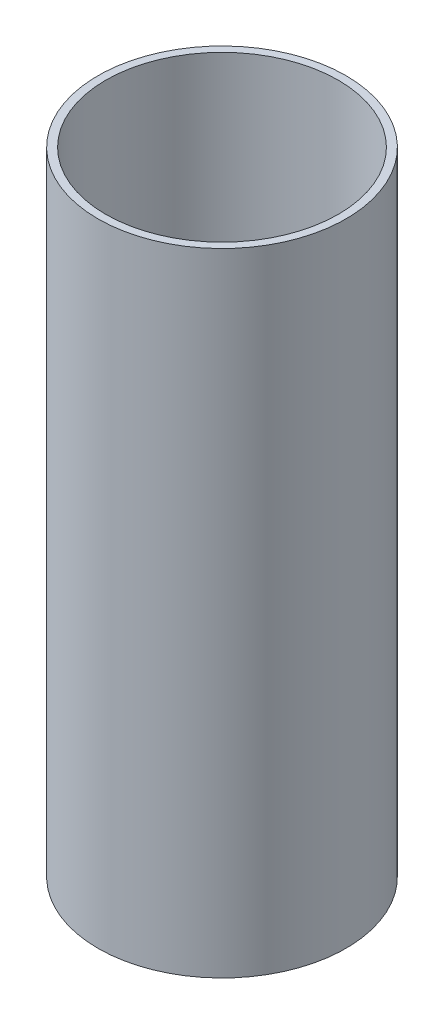
ISO-10303-21;
HEADER;
FILE_DESCRIPTION(('STEP AP214'),'2;1');
FILE_NAME('part.step','',(''),(''),'','','');
FILE_SCHEMA(('AUTOMOTIVE_DESIGN { 1 0 10303 214 1 1 1 1 }'));
ENDSEC;
DATA;
#1=APPLICATION_CONTEXT('core data for automotive mechanical design processes');
#2=APPLICATION_PROTOCOL_DEFINITION('international standard','automotive_design',2000,#1);
#3=PRODUCT_CONTEXT('',#1,'mechanical');
#4=PRODUCT('Part','Part','',(#3));
#5=PRODUCT_RELATED_PRODUCT_CATEGORY('part','',(#4));
#6=PRODUCT_DEFINITION_FORMATION('','',#4);
#7=PRODUCT_DEFINITION_CONTEXT('part definition',#1,'design');
#8=PRODUCT_DEFINITION('design','',#6,#7);
#9=PRODUCT_DEFINITION_SHAPE('','',#8);
#10=(LENGTH_UNIT() NAMED_UNIT(*) SI_UNIT(.MILLI.,.METRE.));
#11=(NAMED_UNIT(*) PLANE_ANGLE_UNIT() SI_UNIT($,.RADIAN.));
#12=(NAMED_UNIT(*) SI_UNIT($,.STERADIAN.) SOLID_ANGLE_UNIT());
#13=UNCERTAINTY_MEASURE_WITH_UNIT(LENGTH_MEASURE(1.E-05),#10,'distance_accuracy_value','');
#14=(GEOMETRIC_REPRESENTATION_CONTEXT(3) GLOBAL_UNCERTAINTY_ASSIGNED_CONTEXT((#13)) GLOBAL_UNIT_ASSIGNED_CONTEXT((#10,
#11,#12)) REPRESENTATION_CONTEXT('',''));
#15=CARTESIAN_POINT('',(0.,0.,0.));
#16=DIRECTION('',(0.,0.,1.));
#17=DIRECTION('',(1.,0.,0.));
#18=AXIS2_PLACEMENT_3D('',#15,#16,#17);
#19=CARTESIAN_POINT('',(0.,203.2,0.));
#20=DIRECTION('',(0.,1.,0.));
#21=DIRECTION('',(0.,0.,1.));
#22=AXIS2_PLACEMENT_3D('',#19,#20,#21);
#23=PLANE('',#22);
#24=CARTESIAN_POINT('',(0.,203.2,0.));
#25=DIRECTION('',(0.,1.,0.));
#26=DIRECTION('',(0.,0.,1.));
#27=AXIS2_PLACEMENT_3D('',#24,#25,#26);
#28=CIRCLE('',#27,39.8970904191699);
#29=CARTESIAN_POINT('',(0.,203.2,39.8970904191699));
#30=VERTEX_POINT('',#29);
#31=EDGE_CURVE('E10',#30,#30,#28,.T.);
#32=ORIENTED_EDGE('',*,*,#31,.T.);
#33=EDGE_LOOP('',(#32));
#34=FACE_BOUND('',#33,.T.);
#35=CARTESIAN_POINT('',(0.,203.2,0.));
#36=DIRECTION('',(0.,1.,0.));
#37=DIRECTION('',(0.,0.,1.));
#38=AXIS2_PLACEMENT_3D('',#35,#36,#37);
#39=CIRCLE('',#38,37.3970904191699);
#40=CARTESIAN_POINT('',(0.,203.2,37.3970904191699));
#41=VERTEX_POINT('',#40);
#42=EDGE_CURVE('E42',#41,#41,#39,.T.);
#43=ORIENTED_EDGE('',*,*,#42,.F.);
#44=EDGE_LOOP('',(#43));
#45=FACE_BOUND('',#44,.T.);
#46=ADVANCED_FACE('F31',(#34,#45),#23,.T.);
#47=CARTESIAN_POINT('',(0.,0.,0.));
#48=DIRECTION('',(0.,1.,0.));
#49=DIRECTION('',(0.,0.,1.));
#50=AXIS2_PLACEMENT_3D('',#47,#48,#49);
#51=PLANE('',#50);
#52=CARTESIAN_POINT('',(0.,0.,0.));
#53=DIRECTION('',(0.,1.,0.));
#54=DIRECTION('',(0.,0.,1.));
#55=AXIS2_PLACEMENT_3D('',#52,#53,#54);
#56=CIRCLE('',#55,39.8970904191699);
#57=CARTESIAN_POINT('',(0.,0.,39.8970904191699));
#58=VERTEX_POINT('',#57);
#59=EDGE_CURVE('E35',#58,#58,#56,.T.);
#60=ORIENTED_EDGE('',*,*,#59,.F.);
#61=EDGE_LOOP('',(#60));
#62=FACE_BOUND('',#61,.T.);
#63=CARTESIAN_POINT('',(0.,0.,0.));
#64=DIRECTION('',(0.,1.,0.));
#65=DIRECTION('',(0.,0.,1.));
#66=AXIS2_PLACEMENT_3D('',#63,#64,#65);
#67=CIRCLE('',#66,37.3970904191699);
#68=CARTESIAN_POINT('',(0.,0.,37.3970904191699));
#69=VERTEX_POINT('',#68);
#70=EDGE_CURVE('E44',#69,#69,#67,.T.);
#71=ORIENTED_EDGE('',*,*,#70,.T.);
#72=EDGE_LOOP('',(#71));
#73=FACE_BOUND('',#72,.T.);
#74=ADVANCED_FACE('F54',(#62,#73),#51,.F.);
#75=CARTESIAN_POINT('',(0.,203.2,0.));
#76=DIRECTION('',(0.,-1.,0.));
#77=DIRECTION('',(0.,0.,-1.));
#78=AXIS2_PLACEMENT_3D('',#75,#76,#77);
#79=CYLINDRICAL_SURFACE('',#78,39.8970904191699);
#80=ORIENTED_EDGE('',*,*,#31,.F.);
#81=EDGE_LOOP('',(#80));
#82=FACE_BOUND('',#81,.T.);
#83=ORIENTED_EDGE('',*,*,#59,.T.);
#84=EDGE_LOOP('',(#83));
#85=FACE_BOUND('',#84,.T.);
#86=ADVANCED_FACE('F33',(#82,#85),#79,.T.);
#87=CARTESIAN_POINT('',(0.,203.2,0.));
#88=DIRECTION('',(0.,-1.,0.));
#89=DIRECTION('',(0.,0.,-1.));
#90=AXIS2_PLACEMENT_3D('',#87,#88,#89);
#91=CYLINDRICAL_SURFACE('',#90,37.3970904191699);
#92=ORIENTED_EDGE('',*,*,#42,.T.);
#93=EDGE_LOOP('',(#92));
#94=FACE_BOUND('',#93,.T.);
#95=ORIENTED_EDGE('',*,*,#70,.F.);
#96=EDGE_LOOP('',(#95));
#97=FACE_BOUND('',#96,.T.);
#98=ADVANCED_FACE('F50',(#94,#97),#91,.F.);
#99=CLOSED_SHELL('',(#46,#74,#86,#98));
#100=MANIFOLD_SOLID_BREP('B2',#99);
#101=ADVANCED_BREP_SHAPE_REPRESENTATION('',(#18,#100),#14);
#102=SHAPE_DEFINITION_REPRESENTATION(#9,#101);
ENDSEC;
END-ISO-10303-21;
